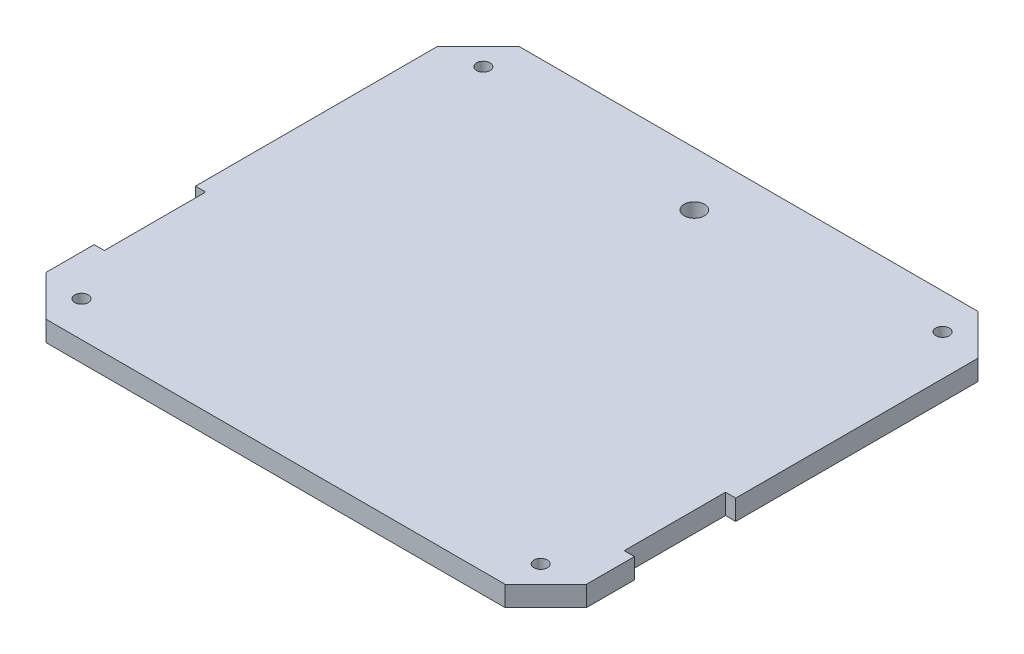
ISO-10303-21;
HEADER;
FILE_DESCRIPTION(('STEP AP214'),'2;1');
FILE_NAME('part.step','',(''),(''),'','','');
FILE_SCHEMA(('AUTOMOTIVE_DESIGN { 1 0 10303 214 1 1 1 1 }'));
ENDSEC;
DATA;
#1=APPLICATION_CONTEXT('core data for automotive mechanical design processes');
#2=APPLICATION_PROTOCOL_DEFINITION('international standard','automotive_design',2000,#1);
#3=PRODUCT_CONTEXT('',#1,'mechanical');
#4=PRODUCT('Part','Part','',(#3));
#5=PRODUCT_RELATED_PRODUCT_CATEGORY('part','',(#4));
#6=PRODUCT_DEFINITION_FORMATION('','',#4);
#7=PRODUCT_DEFINITION_CONTEXT('part definition',#1,'design');
#8=PRODUCT_DEFINITION('design','',#6,#7);
#9=PRODUCT_DEFINITION_SHAPE('','',#8);
#10=(LENGTH_UNIT() NAMED_UNIT(*) SI_UNIT(.MILLI.,.METRE.));
#11=(NAMED_UNIT(*) PLANE_ANGLE_UNIT() SI_UNIT($,.RADIAN.));
#12=(NAMED_UNIT(*) SI_UNIT($,.STERADIAN.) SOLID_ANGLE_UNIT());
#13=UNCERTAINTY_MEASURE_WITH_UNIT(LENGTH_MEASURE(1.E-05),#10,'distance_accuracy_value','');
#14=(GEOMETRIC_REPRESENTATION_CONTEXT(3) GLOBAL_UNCERTAINTY_ASSIGNED_CONTEXT((#13)) GLOBAL_UNIT_ASSIGNED_CONTEXT((#10,
#11,#12)) REPRESENTATION_CONTEXT('',''));
#15=CARTESIAN_POINT('',(0.,0.,0.));
#16=DIRECTION('',(0.,0.,1.));
#17=DIRECTION('',(1.,0.,0.));
#18=AXIS2_PLACEMENT_3D('',#15,#16,#17);
#19=CARTESIAN_POINT('',(0.,15.,34.3683747497509));
#20=DIRECTION('',(0.,0.,-1.));
#21=DIRECTION('',(-1.,0.,0.));
#22=AXIS2_PLACEMENT_3D('',#19,#20,#21);
#23=PLANE('',#22);
#24=DIRECTION('',(1.,0.,0.));
#25=VECTOR('',#24,1.);
#26=CARTESIAN_POINT('',(0.,0.,34.3683747497509));
#27=LINE('',#26,#25);
#28=CARTESIAN_POINT('',(192.446978441032,0.,34.3683747497509));
#29=VERTEX_POINT('',#28);
#30=CARTESIAN_POINT('',(200.,0.,34.3683747497509));
#31=VERTEX_POINT('',#30);
#32=EDGE_CURVE('E260',#29,#31,#27,.T.);
#33=ORIENTED_EDGE('',*,*,#32,.T.);
#34=DIRECTION('',(0.,-1.,0.));
#35=VECTOR('',#34,1.);
#36=CARTESIAN_POINT('',(200.,15.,34.3683747497509));
#37=LINE('',#36,#35);
#38=CARTESIAN_POINT('',(200.,15.,34.3683747497509));
#39=VERTEX_POINT('',#38);
#40=EDGE_CURVE('E11',#39,#31,#37,.T.);
#41=ORIENTED_EDGE('',*,*,#40,.F.);
#42=DIRECTION('',(1.,0.,0.));
#43=VECTOR('',#42,1.);
#44=CARTESIAN_POINT('',(0.,15.,34.3683747497509));
#45=LINE('',#44,#43);
#46=CARTESIAN_POINT('',(192.446978441032,15.,34.3683747497509));
#47=VERTEX_POINT('',#46);
#48=EDGE_CURVE('E185',#47,#39,#45,.T.);
#49=ORIENTED_EDGE('',*,*,#48,.F.);
#50=DIRECTION('',(0.,-1.,0.));
#51=VECTOR('',#50,1.);
#52=CARTESIAN_POINT('',(192.446978441032,15.,34.3683747497509));
#53=LINE('',#52,#51);
#54=EDGE_CURVE('E186',#47,#29,#53,.T.);
#55=ORIENTED_EDGE('',*,*,#54,.T.);
#56=EDGE_LOOP('',(#33,#41,#49,#55));
#57=FACE_BOUND('',#56,.T.);
#58=ADVANCED_FACE('F35',(#57),#23,.F.);
#59=CARTESIAN_POINT('',(200.,15.,0.));
#60=DIRECTION('',(-1.,0.,0.));
#61=DIRECTION('',(0.,0.,1.));
#62=AXIS2_PLACEMENT_3D('',#59,#60,#61);
#63=PLANE('',#62);
#64=DIRECTION('',(0.,0.,-1.));
#65=VECTOR('',#64,1.);
#66=CARTESIAN_POINT('',(200.,0.,0.));
#67=LINE('',#66,#65);
#68=CARTESIAN_POINT('',(200.,0.,-145.));
#69=VERTEX_POINT('',#68);
#70=EDGE_CURVE('E263',#31,#69,#67,.T.);
#71=ORIENTED_EDGE('',*,*,#70,.T.);
#72=DIRECTION('',(0.,1.,0.));
#73=VECTOR('',#72,1.);
#74=CARTESIAN_POINT('',(200.,0.,-145.));
#75=LINE('',#74,#73);
#76=CARTESIAN_POINT('',(200.,15.,-145.));
#77=VERTEX_POINT('',#76);
#78=EDGE_CURVE('E49',#69,#77,#75,.T.);
#79=ORIENTED_EDGE('',*,*,#78,.T.);
#80=DIRECTION('',(0.,0.,-1.));
#81=VECTOR('',#80,1.);
#82=CARTESIAN_POINT('',(200.,15.,0.));
#83=LINE('',#82,#81);
#84=EDGE_CURVE('E297',#39,#77,#83,.T.);
#85=ORIENTED_EDGE('',*,*,#84,.F.);
#86=ORIENTED_EDGE('',*,*,#40,.T.);
#87=EDGE_LOOP('',(#71,#79,#85,#86));
#88=FACE_BOUND('',#87,.T.);
#89=ADVANCED_FACE('F302',(#88),#63,.F.);
#90=CARTESIAN_POINT('',(0.,15.,-175.));
#91=DIRECTION('',(0.,0.,-1.));
#92=DIRECTION('',(-1.,0.,0.));
#93=AXIS2_PLACEMENT_3D('',#90,#91,#92);
#94=PLANE('',#93);
#95=DIRECTION('',(0.,1.,0.));
#96=VECTOR('',#95,1.);
#97=CARTESIAN_POINT('',(170.,0.,-175.));
#98=LINE('',#97,#96);
#99=CARTESIAN_POINT('',(170.,0.,-175.));
#100=VERTEX_POINT('',#99);
#101=CARTESIAN_POINT('',(170.,15.,-175.));
#102=VERTEX_POINT('',#101);
#103=EDGE_CURVE('E274',#100,#102,#98,.T.);
#104=ORIENTED_EDGE('',*,*,#103,.F.);
#105=DIRECTION('',(1.,0.,0.));
#106=VECTOR('',#105,1.);
#107=CARTESIAN_POINT('',(0.,0.,-175.));
#108=LINE('',#107,#106);
#109=CARTESIAN_POINT('',(-170.,0.,-175.));
#110=VERTEX_POINT('',#109);
#111=EDGE_CURVE('E219',#110,#100,#108,.T.);
#112=ORIENTED_EDGE('',*,*,#111,.F.);
#113=DIRECTION('',(0.,1.,0.));
#114=VECTOR('',#113,1.);
#115=CARTESIAN_POINT('',(-170.,0.,-175.));
#116=LINE('',#115,#114);
#117=CARTESIAN_POINT('',(-170.,15.,-175.));
#118=VERTEX_POINT('',#117);
#119=EDGE_CURVE('E57',#110,#118,#116,.T.);
#120=ORIENTED_EDGE('',*,*,#119,.T.);
#121=DIRECTION('',(1.,0.,0.));
#122=VECTOR('',#121,1.);
#123=CARTESIAN_POINT('',(0.,15.,-175.));
#124=LINE('',#123,#122);
#125=EDGE_CURVE('E246',#118,#102,#124,.T.);
#126=ORIENTED_EDGE('',*,*,#125,.T.);
#127=EDGE_LOOP('',(#104,#112,#120,#126));
#128=FACE_BOUND('',#127,.T.);
#129=ADVANCED_FACE('F271',(#128),#94,.T.);
#130=CARTESIAN_POINT('',(-200.,15.,0.));
#131=DIRECTION('',(-1.,0.,0.));
#132=DIRECTION('',(0.,0.,1.));
#133=AXIS2_PLACEMENT_3D('',#130,#131,#132);
#134=PLANE('',#133);
#135=DIRECTION('',(0.,1.,0.));
#136=VECTOR('',#135,1.);
#137=CARTESIAN_POINT('',(-200.,0.,-145.));
#138=LINE('',#137,#136);
#139=CARTESIAN_POINT('',(-200.,0.,-145.));
#140=VERTEX_POINT('',#139);
#141=CARTESIAN_POINT('',(-200.,15.,-145.));
#142=VERTEX_POINT('',#141);
#143=EDGE_CURVE('E218',#140,#142,#138,.T.);
#144=ORIENTED_EDGE('',*,*,#143,.F.);
#145=DIRECTION('',(0.,0.,-1.));
#146=VECTOR('',#145,1.);
#147=CARTESIAN_POINT('',(-200.,0.,0.));
#148=LINE('',#147,#146);
#149=CARTESIAN_POINT('',(-200.,0.,34.3683747497509));
#150=VERTEX_POINT('',#149);
#151=EDGE_CURVE('E216',#150,#140,#148,.T.);
#152=ORIENTED_EDGE('',*,*,#151,.F.);
#153=DIRECTION('',(0.,-1.,0.));
#154=VECTOR('',#153,1.);
#155=CARTESIAN_POINT('',(-200.,15.,34.3683747497509));
#156=LINE('',#155,#154);
#157=CARTESIAN_POINT('',(-200.,15.,34.3683747497509));
#158=VERTEX_POINT('',#157);
#159=EDGE_CURVE('E42',#158,#150,#156,.T.);
#160=ORIENTED_EDGE('',*,*,#159,.F.);
#161=DIRECTION('',(0.,0.,-1.));
#162=VECTOR('',#161,1.);
#163=CARTESIAN_POINT('',(-200.,15.,0.));
#164=LINE('',#163,#162);
#165=EDGE_CURVE('E242',#158,#142,#164,.T.);
#166=ORIENTED_EDGE('',*,*,#165,.T.);
#167=EDGE_LOOP('',(#144,#152,#160,#166));
#168=FACE_BOUND('',#167,.T.);
#169=ADVANCED_FACE('F217',(#168),#134,.T.);
#170=CARTESIAN_POINT('',(0.,15.,34.3683747497509));
#171=DIRECTION('',(0.,0.,1.));
#172=DIRECTION('',(1.,0.,0.));
#173=AXIS2_PLACEMENT_3D('',#170,#171,#172);
#174=PLANE('',#173);
#175=DIRECTION('',(-1.,0.,0.));
#176=VECTOR('',#175,1.);
#177=CARTESIAN_POINT('',(0.,0.,34.3683747497509));
#178=LINE('',#177,#176);
#179=CARTESIAN_POINT('',(-192.446978441032,0.,34.3683747497509));
#180=VERTEX_POINT('',#179);
#181=EDGE_CURVE('E207',#180,#150,#178,.T.);
#182=ORIENTED_EDGE('',*,*,#181,.F.);
#183=DIRECTION('',(0.,-1.,0.));
#184=VECTOR('',#183,1.);
#185=CARTESIAN_POINT('',(-192.446978441032,15.,34.3683747497509));
#186=LINE('',#185,#184);
#187=CARTESIAN_POINT('',(-192.446978441032,15.,34.3683747497509));
#188=VERTEX_POINT('',#187);
#189=EDGE_CURVE('E200',#188,#180,#186,.T.);
#190=ORIENTED_EDGE('',*,*,#189,.F.);
#191=DIRECTION('',(-1.,0.,0.));
#192=VECTOR('',#191,1.);
#193=CARTESIAN_POINT('',(0.,15.,34.3683747497509));
#194=LINE('',#193,#192);
#195=EDGE_CURVE('E210',#188,#158,#194,.T.);
#196=ORIENTED_EDGE('',*,*,#195,.T.);
#197=ORIENTED_EDGE('',*,*,#159,.T.);
#198=EDGE_LOOP('',(#182,#190,#196,#197));
#199=FACE_BOUND('',#198,.T.);
#200=ADVANCED_FACE('F205',(#199),#174,.T.);
#201=CARTESIAN_POINT('',(-192.446978441032,15.,0.));
#202=DIRECTION('',(-1.,0.,0.));
#203=DIRECTION('',(0.,0.,1.));
#204=AXIS2_PLACEMENT_3D('',#201,#202,#203);
#205=PLANE('',#204);
#206=DIRECTION('',(0.,0.,-1.));
#207=VECTOR('',#206,1.);
#208=CARTESIAN_POINT('',(-192.446978441032,0.,0.));
#209=LINE('',#208,#207);
#210=CARTESIAN_POINT('',(-192.446978441032,0.,109.368374749751));
#211=VERTEX_POINT('',#210);
#212=EDGE_CURVE('E223',#211,#180,#209,.T.);
#213=ORIENTED_EDGE('',*,*,#212,.F.);
#214=DIRECTION('',(0.,-1.,0.));
#215=VECTOR('',#214,1.);
#216=CARTESIAN_POINT('',(-192.446978441032,15.,109.368374749751));
#217=LINE('',#216,#215);
#218=CARTESIAN_POINT('',(-192.446978441032,15.,109.368374749751));
#219=VERTEX_POINT('',#218);
#220=EDGE_CURVE('E198',#219,#211,#217,.T.);
#221=ORIENTED_EDGE('',*,*,#220,.F.);
#222=DIRECTION('',(0.,0.,-1.));
#223=VECTOR('',#222,1.);
#224=CARTESIAN_POINT('',(-192.446978441032,15.,0.));
#225=LINE('',#224,#223);
#226=EDGE_CURVE('E236',#219,#188,#225,.T.);
#227=ORIENTED_EDGE('',*,*,#226,.T.);
#228=ORIENTED_EDGE('',*,*,#189,.T.);
#229=EDGE_LOOP('',(#213,#221,#227,#228));
#230=FACE_BOUND('',#229,.T.);
#231=ADVANCED_FACE('F233',(#230),#205,.T.);
#232=CARTESIAN_POINT('',(0.,15.,109.368374749751));
#233=DIRECTION('',(0.,0.,1.));
#234=DIRECTION('',(1.,0.,0.));
#235=AXIS2_PLACEMENT_3D('',#232,#233,#234);
#236=PLANE('',#235);
#237=DIRECTION('',(-1.,0.,0.));
#238=VECTOR('',#237,1.);
#239=CARTESIAN_POINT('',(0.,0.,109.368374749751));
#240=LINE('',#239,#238);
#241=CARTESIAN_POINT('',(-200.,0.,109.368374749751));
#242=VERTEX_POINT('',#241);
#243=EDGE_CURVE('E177',#211,#242,#240,.T.);
#244=ORIENTED_EDGE('',*,*,#243,.T.);
#245=DIRECTION('',(0.,-1.,0.));
#246=VECTOR('',#245,1.);
#247=CARTESIAN_POINT('',(-200.,15.,109.368374749751));
#248=LINE('',#247,#246);
#249=CARTESIAN_POINT('',(-200.,15.,109.368374749751));
#250=VERTEX_POINT('',#249);
#251=EDGE_CURVE('E195',#250,#242,#248,.T.);
#252=ORIENTED_EDGE('',*,*,#251,.F.);
#253=DIRECTION('',(-1.,0.,0.));
#254=VECTOR('',#253,1.);
#255=CARTESIAN_POINT('',(0.,15.,109.368374749751));
#256=LINE('',#255,#254);
#257=EDGE_CURVE('E244',#219,#250,#256,.T.);
#258=ORIENTED_EDGE('',*,*,#257,.F.);
#259=ORIENTED_EDGE('',*,*,#220,.T.);
#260=EDGE_LOOP('',(#244,#252,#258,#259));
#261=FACE_BOUND('',#260,.T.);
#262=ADVANCED_FACE('F230',(#261),#236,.F.);
#263=CARTESIAN_POINT('',(-200.,15.,0.));
#264=DIRECTION('',(-1.,0.,0.));
#265=DIRECTION('',(0.,0.,1.));
#266=AXIS2_PLACEMENT_3D('',#263,#264,#265);
#267=PLANE('',#266);
#268=DIRECTION('',(0.,1.,0.));
#269=VECTOR('',#268,1.);
#270=CARTESIAN_POINT('',(-200.,0.,145.));
#271=LINE('',#270,#269);
#272=CARTESIAN_POINT('',(-200.,0.,145.));
#273=VERTEX_POINT('',#272);
#274=CARTESIAN_POINT('',(-200.,15.,145.));
#275=VERTEX_POINT('',#274);
#276=EDGE_CURVE('E152',#273,#275,#271,.T.);
#277=ORIENTED_EDGE('',*,*,#276,.T.);
#278=DIRECTION('',(0.,0.,-1.));
#279=VECTOR('',#278,1.);
#280=CARTESIAN_POINT('',(-200.,15.,0.));
#281=LINE('',#280,#279);
#282=EDGE_CURVE('E251',#275,#250,#281,.T.);
#283=ORIENTED_EDGE('',*,*,#282,.T.);
#284=ORIENTED_EDGE('',*,*,#251,.T.);
#285=DIRECTION('',(0.,0.,-1.));
#286=VECTOR('',#285,1.);
#287=CARTESIAN_POINT('',(-200.,0.,0.));
#288=LINE('',#287,#286);
#289=EDGE_CURVE('E173',#273,#242,#288,.T.);
#290=ORIENTED_EDGE('',*,*,#289,.F.);
#291=EDGE_LOOP('',(#277,#283,#284,#290));
#292=FACE_BOUND('',#291,.T.);
#293=ADVANCED_FACE('F356',(#292),#267,.T.);
#294=CARTESIAN_POINT('',(0.,15.,175.));
#295=DIRECTION('',(0.,0.,-1.));
#296=DIRECTION('',(-1.,0.,0.));
#297=AXIS2_PLACEMENT_3D('',#294,#295,#296);
#298=PLANE('',#297);
#299=DIRECTION('',(1.,0.,0.));
#300=VECTOR('',#299,1.);
#301=CARTESIAN_POINT('',(0.,15.,175.));
#302=LINE('',#301,#300);
#303=CARTESIAN_POINT('',(-170.,15.,175.));
#304=VERTEX_POINT('',#303);
#305=CARTESIAN_POINT('',(170.,15.,175.));
#306=VERTEX_POINT('',#305);
#307=EDGE_CURVE('E165',#304,#306,#302,.T.);
#308=ORIENTED_EDGE('',*,*,#307,.F.);
#309=DIRECTION('',(0.,1.,0.));
#310=VECTOR('',#309,1.);
#311=CARTESIAN_POINT('',(-170.,0.,175.));
#312=LINE('',#311,#310);
#313=CARTESIAN_POINT('',(-170.,0.,175.));
#314=VERTEX_POINT('',#313);
#315=EDGE_CURVE('E149',#314,#304,#312,.T.);
#316=ORIENTED_EDGE('',*,*,#315,.F.);
#317=DIRECTION('',(1.,0.,0.));
#318=VECTOR('',#317,1.);
#319=CARTESIAN_POINT('',(0.,0.,175.));
#320=LINE('',#319,#318);
#321=CARTESIAN_POINT('',(170.,0.,175.));
#322=VERTEX_POINT('',#321);
#323=EDGE_CURVE('E163',#314,#322,#320,.T.);
#324=ORIENTED_EDGE('',*,*,#323,.T.);
#325=DIRECTION('',(0.,1.,0.));
#326=VECTOR('',#325,1.);
#327=CARTESIAN_POINT('',(170.,0.,175.));
#328=LINE('',#327,#326);
#329=EDGE_CURVE('E322',#322,#306,#328,.T.);
#330=ORIENTED_EDGE('',*,*,#329,.T.);
#331=EDGE_LOOP('',(#308,#316,#324,#330));
#332=FACE_BOUND('',#331,.T.);
#333=ADVANCED_FACE('F161',(#332),#298,.F.);
#334=CARTESIAN_POINT('',(200.,15.,0.));
#335=DIRECTION('',(-1.,0.,0.));
#336=DIRECTION('',(0.,0.,1.));
#337=AXIS2_PLACEMENT_3D('',#334,#335,#336);
#338=PLANE('',#337);
#339=DIRECTION('',(0.,0.,-1.));
#340=VECTOR('',#339,1.);
#341=CARTESIAN_POINT('',(200.,15.,0.));
#342=LINE('',#341,#340);
#343=CARTESIAN_POINT('',(200.,15.,145.));
#344=VERTEX_POINT('',#343);
#345=CARTESIAN_POINT('',(200.,15.,109.368374749751));
#346=VERTEX_POINT('',#345);
#347=EDGE_CURVE('E254',#344,#346,#342,.T.);
#348=ORIENTED_EDGE('',*,*,#347,.F.);
#349=DIRECTION('',(0.,1.,0.));
#350=VECTOR('',#349,1.);
#351=CARTESIAN_POINT('',(200.,0.,145.));
#352=LINE('',#351,#350);
#353=CARTESIAN_POINT('',(200.,0.,145.));
#354=VERTEX_POINT('',#353);
#355=EDGE_CURVE('E319',#354,#344,#352,.T.);
#356=ORIENTED_EDGE('',*,*,#355,.F.);
#357=DIRECTION('',(0.,0.,-1.));
#358=VECTOR('',#357,1.);
#359=CARTESIAN_POINT('',(200.,0.,0.));
#360=LINE('',#359,#358);
#361=CARTESIAN_POINT('',(200.,0.,109.368374749751));
#362=VERTEX_POINT('',#361);
#363=EDGE_CURVE('E172',#354,#362,#360,.T.);
#364=ORIENTED_EDGE('',*,*,#363,.T.);
#365=DIRECTION('',(0.,-1.,0.));
#366=VECTOR('',#365,1.);
#367=CARTESIAN_POINT('',(200.,15.,109.368374749751));
#368=LINE('',#367,#366);
#369=EDGE_CURVE('E192',#346,#362,#368,.T.);
#370=ORIENTED_EDGE('',*,*,#369,.F.);
#371=EDGE_LOOP('',(#348,#356,#364,#370));
#372=FACE_BOUND('',#371,.T.);
#373=ADVANCED_FACE('F318',(#372),#338,.F.);
#374=CARTESIAN_POINT('',(0.,15.,109.368374749751));
#375=DIRECTION('',(0.,0.,-1.));
#376=DIRECTION('',(-1.,0.,0.));
#377=AXIS2_PLACEMENT_3D('',#374,#375,#376);
#378=PLANE('',#377);
#379=DIRECTION('',(1.,0.,0.));
#380=VECTOR('',#379,1.);
#381=CARTESIAN_POINT('',(0.,0.,109.368374749751));
#382=LINE('',#381,#380);
#383=CARTESIAN_POINT('',(192.446978441032,0.,109.368374749751));
#384=VERTEX_POINT('',#383);
#385=EDGE_CURVE('E175',#384,#362,#382,.T.);
#386=ORIENTED_EDGE('',*,*,#385,.F.);
#387=DIRECTION('',(0.,-1.,0.));
#388=VECTOR('',#387,1.);
#389=CARTESIAN_POINT('',(192.446978441032,15.,109.368374749751));
#390=LINE('',#389,#388);
#391=CARTESIAN_POINT('',(192.446978441032,15.,109.368374749751));
#392=VERTEX_POINT('',#391);
#393=EDGE_CURVE('E189',#392,#384,#390,.T.);
#394=ORIENTED_EDGE('',*,*,#393,.F.);
#395=DIRECTION('',(1.,0.,0.));
#396=VECTOR('',#395,1.);
#397=CARTESIAN_POINT('',(0.,15.,109.368374749751));
#398=LINE('',#397,#396);
#399=EDGE_CURVE('E256',#392,#346,#398,.T.);
#400=ORIENTED_EDGE('',*,*,#399,.T.);
#401=ORIENTED_EDGE('',*,*,#369,.T.);
#402=EDGE_LOOP('',(#386,#394,#400,#401));
#403=FACE_BOUND('',#402,.T.);
#404=ADVANCED_FACE('F313',(#403),#378,.T.);
#405=CARTESIAN_POINT('',(192.446978441032,15.,0.));
#406=DIRECTION('',(-1.,0.,0.));
#407=DIRECTION('',(0.,0.,1.));
#408=AXIS2_PLACEMENT_3D('',#405,#406,#407);
#409=PLANE('',#408);
#410=DIRECTION('',(0.,0.,-1.));
#411=VECTOR('',#410,1.);
#412=CARTESIAN_POINT('',(192.446978441032,0.,0.));
#413=LINE('',#412,#411);
#414=EDGE_CURVE('E183',#384,#29,#413,.T.);
#415=ORIENTED_EDGE('',*,*,#414,.T.);
#416=ORIENTED_EDGE('',*,*,#54,.F.);
#417=DIRECTION('',(0.,0.,-1.));
#418=VECTOR('',#417,1.);
#419=CARTESIAN_POINT('',(192.446978441032,15.,0.));
#420=LINE('',#419,#418);
#421=EDGE_CURVE('E190',#392,#47,#420,.T.);
#422=ORIENTED_EDGE('',*,*,#421,.F.);
#423=ORIENTED_EDGE('',*,*,#393,.T.);
#424=EDGE_LOOP('',(#415,#416,#422,#423));
#425=FACE_BOUND('',#424,.T.);
#426=ADVANCED_FACE('F310',(#425),#409,.F.);
#427=CARTESIAN_POINT('',(0.,15.,0.));
#428=DIRECTION('',(0.,1.,0.));
#429=DIRECTION('',(0.,0.,1.));
#430=AXIS2_PLACEMENT_3D('',#427,#428,#429);
#431=PLANE('',#430);
#432=CARTESIAN_POINT('',(0.,15.,-135.));
#433=DIRECTION('',(0.,-1.,0.));
#434=DIRECTION('',(0.,0.,-1.));
#435=AXIS2_PLACEMENT_3D('',#432,#433,#434);
#436=CIRCLE('',#435,7.5);
#437=CARTESIAN_POINT('',(0.,15.,-142.5));
#438=VERTEX_POINT('',#437);
#439=EDGE_CURVE('E429',#438,#438,#436,.T.);
#440=ORIENTED_EDGE('',*,*,#439,.T.);
#441=EDGE_LOOP('',(#440));
#442=FACE_BOUND('',#441,.T.);
#443=DIRECTION('',(-0.707106781186547,0.,-0.707106781186547));
#444=VECTOR('',#443,1.);
#445=CARTESIAN_POINT('',(-170.,15.,175.));
#446=LINE('',#445,#444);
#447=EDGE_CURVE('E156',#304,#275,#446,.T.);
#448=ORIENTED_EDGE('',*,*,#447,.F.);
#449=ORIENTED_EDGE('',*,*,#307,.T.);
#450=DIRECTION('',(-0.707106781186547,0.,0.707106781186547));
#451=VECTOR('',#450,1.);
#452=CARTESIAN_POINT('',(170.,15.,175.));
#453=LINE('',#452,#451);
#454=EDGE_CURVE('E276',#344,#306,#453,.T.);
#455=ORIENTED_EDGE('',*,*,#454,.F.);
#456=ORIENTED_EDGE('',*,*,#347,.T.);
#457=ORIENTED_EDGE('',*,*,#399,.F.);
#458=ORIENTED_EDGE('',*,*,#421,.T.);
#459=ORIENTED_EDGE('',*,*,#48,.T.);
#460=ORIENTED_EDGE('',*,*,#84,.T.);
#461=DIRECTION('',(0.707106781186547,0.,0.707106781186547));
#462=VECTOR('',#461,1.);
#463=CARTESIAN_POINT('',(170.,15.,-175.));
#464=LINE('',#463,#462);
#465=EDGE_CURVE('E281',#102,#77,#464,.T.);
#466=ORIENTED_EDGE('',*,*,#465,.F.);
#467=ORIENTED_EDGE('',*,*,#125,.F.);
#468=DIRECTION('',(0.707106781186547,0.,-0.707106781186547));
#469=VECTOR('',#468,1.);
#470=CARTESIAN_POINT('',(-170.,15.,-175.));
#471=LINE('',#470,#469);
#472=EDGE_CURVE('E166',#142,#118,#471,.T.);
#473=ORIENTED_EDGE('',*,*,#472,.F.);
#474=ORIENTED_EDGE('',*,*,#165,.F.);
#475=ORIENTED_EDGE('',*,*,#195,.F.);
#476=ORIENTED_EDGE('',*,*,#226,.F.);
#477=ORIENTED_EDGE('',*,*,#257,.T.);
#478=ORIENTED_EDGE('',*,*,#282,.F.);
#479=EDGE_LOOP('',(#448,#449,#455,#456,#457,#458,#459,#460,#466,#467,#473,#474,#475,#476,#477,#478));
#480=FACE_BOUND('',#479,.T.);
#481=CARTESIAN_POINT('',(-170.,15.,-148.75));
#482=DIRECTION('',(0.,1.,0.));
#483=DIRECTION('',(0.,0.,1.));
#484=AXIS2_PLACEMENT_3D('',#481,#482,#483);
#485=CIRCLE('',#484,5.00000000000002);
#486=CARTESIAN_POINT('',(-170.,15.,-143.75));
#487=VERTEX_POINT('',#486);
#488=EDGE_CURVE('E287',#487,#487,#485,.T.);
#489=ORIENTED_EDGE('',*,*,#488,.F.);
#490=EDGE_LOOP('',(#489));
#491=FACE_BOUND('',#490,.T.);
#492=CARTESIAN_POINT('',(170.,15.,-148.75));
#493=DIRECTION('',(0.,1.,0.));
#494=DIRECTION('',(0.,0.,-1.));
#495=AXIS2_PLACEMENT_3D('',#492,#493,#494);
#496=CIRCLE('',#495,5.00000000000002);
#497=CARTESIAN_POINT('',(170.,15.,-153.75));
#498=VERTEX_POINT('',#497);
#499=EDGE_CURVE('E412',#498,#498,#496,.T.);
#500=ORIENTED_EDGE('',*,*,#499,.F.);
#501=EDGE_LOOP('',(#500));
#502=FACE_BOUND('',#501,.T.);
#503=CARTESIAN_POINT('',(170.,15.,148.75));
#504=DIRECTION('',(0.,1.,0.));
#505=DIRECTION('',(0.,0.,1.));
#506=AXIS2_PLACEMENT_3D('',#503,#504,#505);
#507=CIRCLE('',#506,5.00000000000002);
#508=CARTESIAN_POINT('',(170.,15.,153.75));
#509=VERTEX_POINT('',#508);
#510=EDGE_CURVE('E418',#509,#509,#507,.T.);
#511=ORIENTED_EDGE('',*,*,#510,.F.);
#512=EDGE_LOOP('',(#511));
#513=FACE_BOUND('',#512,.T.);
#514=CARTESIAN_POINT('',(-170.,15.,148.75));
#515=DIRECTION('',(0.,1.,0.));
#516=DIRECTION('',(0.,0.,-1.));
#517=AXIS2_PLACEMENT_3D('',#514,#515,#516);
#518=CIRCLE('',#517,5.00000000000002);
#519=CARTESIAN_POINT('',(-170.,15.,143.75));
#520=VERTEX_POINT('',#519);
#521=EDGE_CURVE('E427',#520,#520,#518,.T.);
#522=ORIENTED_EDGE('',*,*,#521,.F.);
#523=EDGE_LOOP('',(#522));
#524=FACE_BOUND('',#523,.T.);
#525=ADVANCED_FACE('F238',(#442,#480,#491,#502,#513,#524),#431,.T.);
#526=CARTESIAN_POINT('',(0.,0.,0.));
#527=DIRECTION('',(0.,1.,0.));
#528=DIRECTION('',(0.,0.,1.));
#529=AXIS2_PLACEMENT_3D('',#526,#527,#528);
#530=PLANE('',#529);
#531=CARTESIAN_POINT('',(0.,0.,-135.));
#532=DIRECTION('',(0.,-1.,0.));
#533=DIRECTION('',(0.,0.,-1.));
#534=AXIS2_PLACEMENT_3D('',#531,#532,#533);
#535=CIRCLE('',#534,7.5);
#536=CARTESIAN_POINT('',(0.,0.,-142.5));
#537=VERTEX_POINT('',#536);
#538=EDGE_CURVE('E435',#537,#537,#535,.T.);
#539=ORIENTED_EDGE('',*,*,#538,.F.);
#540=EDGE_LOOP('',(#539));
#541=FACE_BOUND('',#540,.T.);
#542=CARTESIAN_POINT('',(-170.,0.,-148.75));
#543=DIRECTION('',(0.,1.,0.));
#544=DIRECTION('',(0.,0.,1.));
#545=AXIS2_PLACEMENT_3D('',#542,#543,#544);
#546=CIRCLE('',#545,5.00000000000002);
#547=CARTESIAN_POINT('',(-170.,0.,-143.75));
#548=VERTEX_POINT('',#547);
#549=EDGE_CURVE('E284',#548,#548,#546,.T.);
#550=ORIENTED_EDGE('',*,*,#549,.T.);
#551=EDGE_LOOP('',(#550));
#552=FACE_BOUND('',#551,.T.);
#553=CARTESIAN_POINT('',(170.,0.,-148.75));
#554=DIRECTION('',(0.,1.,0.));
#555=DIRECTION('',(0.,0.,-1.));
#556=AXIS2_PLACEMENT_3D('',#553,#554,#555);
#557=CIRCLE('',#556,5.00000000000002);
#558=CARTESIAN_POINT('',(170.,0.,-153.75));
#559=VERTEX_POINT('',#558);
#560=EDGE_CURVE('E290',#559,#559,#557,.T.);
#561=ORIENTED_EDGE('',*,*,#560,.T.);
#562=EDGE_LOOP('',(#561));
#563=FACE_BOUND('',#562,.T.);
#564=CARTESIAN_POINT('',(170.,0.,148.75));
#565=DIRECTION('',(0.,1.,0.));
#566=DIRECTION('',(0.,0.,1.));
#567=AXIS2_PLACEMENT_3D('',#564,#565,#566);
#568=CIRCLE('',#567,5.00000000000002);
#569=CARTESIAN_POINT('',(170.,0.,153.75));
#570=VERTEX_POINT('',#569);
#571=EDGE_CURVE('E414',#570,#570,#568,.T.);
#572=ORIENTED_EDGE('',*,*,#571,.T.);
#573=EDGE_LOOP('',(#572));
#574=FACE_BOUND('',#573,.T.);
#575=CARTESIAN_POINT('',(-170.,0.,148.75));
#576=DIRECTION('',(0.,1.,0.));
#577=DIRECTION('',(0.,0.,-1.));
#578=AXIS2_PLACEMENT_3D('',#575,#576,#577);
#579=CIRCLE('',#578,5.00000000000002);
#580=CARTESIAN_POINT('',(-170.,0.,143.75));
#581=VERTEX_POINT('',#580);
#582=EDGE_CURVE('E424',#581,#581,#579,.T.);
#583=ORIENTED_EDGE('',*,*,#582,.T.);
#584=EDGE_LOOP('',(#583));
#585=FACE_BOUND('',#584,.T.);
#586=ORIENTED_EDGE('',*,*,#323,.F.);
#587=DIRECTION('',(-0.707106781186547,0.,-0.707106781186547));
#588=VECTOR('',#587,1.);
#589=CARTESIAN_POINT('',(-170.,0.,175.));
#590=LINE('',#589,#588);
#591=EDGE_CURVE('E146',#314,#273,#590,.T.);
#592=ORIENTED_EDGE('',*,*,#591,.T.);
#593=ORIENTED_EDGE('',*,*,#289,.T.);
#594=ORIENTED_EDGE('',*,*,#243,.F.);
#595=ORIENTED_EDGE('',*,*,#212,.T.);
#596=ORIENTED_EDGE('',*,*,#181,.T.);
#597=ORIENTED_EDGE('',*,*,#151,.T.);
#598=DIRECTION('',(0.707106781186547,0.,-0.707106781186547));
#599=VECTOR('',#598,1.);
#600=CARTESIAN_POINT('',(-170.,0.,-175.));
#601=LINE('',#600,#599);
#602=EDGE_CURVE('E268',#140,#110,#601,.T.);
#603=ORIENTED_EDGE('',*,*,#602,.T.);
#604=ORIENTED_EDGE('',*,*,#111,.T.);
#605=DIRECTION('',(0.707106781186547,0.,0.707106781186547));
#606=VECTOR('',#605,1.);
#607=CARTESIAN_POINT('',(170.,0.,-175.));
#608=LINE('',#607,#606);
#609=EDGE_CURVE('E267',#100,#69,#608,.T.);
#610=ORIENTED_EDGE('',*,*,#609,.T.);
#611=ORIENTED_EDGE('',*,*,#70,.F.);
#612=ORIENTED_EDGE('',*,*,#32,.F.);
#613=ORIENTED_EDGE('',*,*,#414,.F.);
#614=ORIENTED_EDGE('',*,*,#385,.T.);
#615=ORIENTED_EDGE('',*,*,#363,.F.);
#616=DIRECTION('',(-0.707106781186547,0.,0.707106781186547));
#617=VECTOR('',#616,1.);
#618=CARTESIAN_POINT('',(170.,0.,175.));
#619=LINE('',#618,#617);
#620=EDGE_CURVE('E171',#354,#322,#619,.T.);
#621=ORIENTED_EDGE('',*,*,#620,.T.);
#622=EDGE_LOOP('',(#586,#592,#593,#594,#595,#596,#597,#603,#604,#610,#611,#612,#613,#614,#615,#621));
#623=FACE_BOUND('',#622,.T.);
#624=ADVANCED_FACE('F169',(#541,#552,#563,#574,#585,#623),#530,.F.);
#625=CARTESIAN_POINT('',(-170.,0.,-175.));
#626=DIRECTION('',(0.707106781186547,0.,0.707106781186547));
#627=DIRECTION('',(0.707106781186548,0.,-0.707106781186548));
#628=AXIS2_PLACEMENT_3D('',#625,#626,#627);
#629=PLANE('',#628);
#630=ORIENTED_EDGE('',*,*,#472,.T.);
#631=ORIENTED_EDGE('',*,*,#119,.F.);
#632=ORIENTED_EDGE('',*,*,#602,.F.);
#633=ORIENTED_EDGE('',*,*,#143,.T.);
#634=EDGE_LOOP('',(#630,#631,#632,#633));
#635=FACE_BOUND('',#634,.T.);
#636=ADVANCED_FACE('F370',(#635),#629,.F.);
#637=CARTESIAN_POINT('',(-170.,0.,148.75));
#638=DIRECTION('',(0.,1.,0.));
#639=DIRECTION('',(0.,0.,1.));
#640=AXIS2_PLACEMENT_3D('',#637,#638,#639);
#641=CYLINDRICAL_SURFACE('',#640,5.00000000000002);
#642=ORIENTED_EDGE('',*,*,#582,.F.);
#643=EDGE_LOOP('',(#642));
#644=FACE_BOUND('',#643,.T.);
#645=ORIENTED_EDGE('',*,*,#521,.T.);
#646=EDGE_LOOP('',(#645));
#647=FACE_BOUND('',#646,.T.);
#648=ADVANCED_FACE('F376',(#644,#647),#641,.F.);
#649=CARTESIAN_POINT('',(170.,0.,148.75));
#650=DIRECTION('',(0.,1.,0.));
#651=DIRECTION('',(0.,0.,1.));
#652=AXIS2_PLACEMENT_3D('',#649,#650,#651);
#653=CYLINDRICAL_SURFACE('',#652,5.00000000000002);
#654=ORIENTED_EDGE('',*,*,#571,.F.);
#655=EDGE_LOOP('',(#654));
#656=FACE_BOUND('',#655,.T.);
#657=ORIENTED_EDGE('',*,*,#510,.T.);
#658=EDGE_LOOP('',(#657));
#659=FACE_BOUND('',#658,.T.);
#660=ADVANCED_FACE('F380',(#656,#659),#653,.F.);
#661=CARTESIAN_POINT('',(170.,0.,-148.75));
#662=DIRECTION('',(0.,1.,0.));
#663=DIRECTION('',(0.,0.,1.));
#664=AXIS2_PLACEMENT_3D('',#661,#662,#663);
#665=CYLINDRICAL_SURFACE('',#664,5.00000000000002);
#666=ORIENTED_EDGE('',*,*,#560,.F.);
#667=EDGE_LOOP('',(#666));
#668=FACE_BOUND('',#667,.T.);
#669=ORIENTED_EDGE('',*,*,#499,.T.);
#670=EDGE_LOOP('',(#669));
#671=FACE_BOUND('',#670,.T.);
#672=ADVANCED_FACE('F336',(#668,#671),#665,.F.);
#673=CARTESIAN_POINT('',(-170.,0.,-148.75));
#674=DIRECTION('',(0.,1.,0.));
#675=DIRECTION('',(0.,0.,1.));
#676=AXIS2_PLACEMENT_3D('',#673,#674,#675);
#677=CYLINDRICAL_SURFACE('',#676,5.00000000000002);
#678=ORIENTED_EDGE('',*,*,#549,.F.);
#679=EDGE_LOOP('',(#678));
#680=FACE_BOUND('',#679,.T.);
#681=ORIENTED_EDGE('',*,*,#488,.T.);
#682=EDGE_LOOP('',(#681));
#683=FACE_BOUND('',#682,.T.);
#684=ADVANCED_FACE('F329',(#680,#683),#677,.F.);
#685=CARTESIAN_POINT('',(170.,0.,-175.));
#686=DIRECTION('',(-0.707106781186547,0.,0.707106781186547));
#687=DIRECTION('',(0.707106781186548,0.,0.707106781186548));
#688=AXIS2_PLACEMENT_3D('',#685,#686,#687);
#689=PLANE('',#688);
#690=ORIENTED_EDGE('',*,*,#465,.T.);
#691=ORIENTED_EDGE('',*,*,#78,.F.);
#692=ORIENTED_EDGE('',*,*,#609,.F.);
#693=ORIENTED_EDGE('',*,*,#103,.T.);
#694=EDGE_LOOP('',(#690,#691,#692,#693));
#695=FACE_BOUND('',#694,.T.);
#696=ADVANCED_FACE('F326',(#695),#689,.F.);
#697=CARTESIAN_POINT('',(170.,0.,175.));
#698=DIRECTION('',(-0.707106781186547,0.,-0.707106781186547));
#699=DIRECTION('',(-0.707106781186548,0.,0.707106781186548));
#700=AXIS2_PLACEMENT_3D('',#697,#698,#699);
#701=PLANE('',#700);
#702=ORIENTED_EDGE('',*,*,#454,.T.);
#703=ORIENTED_EDGE('',*,*,#329,.F.);
#704=ORIENTED_EDGE('',*,*,#620,.F.);
#705=ORIENTED_EDGE('',*,*,#355,.T.);
#706=EDGE_LOOP('',(#702,#703,#704,#705));
#707=FACE_BOUND('',#706,.T.);
#708=ADVANCED_FACE('F328',(#707),#701,.F.);
#709=CARTESIAN_POINT('',(-170.,0.,175.));
#710=DIRECTION('',(0.707106781186547,0.,-0.707106781186547));
#711=DIRECTION('',(-0.707106781186548,0.,-0.707106781186548));
#712=AXIS2_PLACEMENT_3D('',#709,#710,#711);
#713=PLANE('',#712);
#714=ORIENTED_EDGE('',*,*,#447,.T.);
#715=ORIENTED_EDGE('',*,*,#276,.F.);
#716=ORIENTED_EDGE('',*,*,#591,.F.);
#717=ORIENTED_EDGE('',*,*,#315,.T.);
#718=EDGE_LOOP('',(#714,#715,#716,#717));
#719=FACE_BOUND('',#718,.T.);
#720=ADVANCED_FACE('F148',(#719),#713,.F.);
#721=CARTESIAN_POINT('',(0.,15.,-135.));
#722=DIRECTION('',(0.,-1.,0.));
#723=DIRECTION('',(0.,0.,-1.));
#724=AXIS2_PLACEMENT_3D('',#721,#722,#723);
#725=CYLINDRICAL_SURFACE('',#724,7.5);
#726=ORIENTED_EDGE('',*,*,#439,.F.);
#727=EDGE_LOOP('',(#726));
#728=FACE_BOUND('',#727,.T.);
#729=ORIENTED_EDGE('',*,*,#538,.T.);
#730=EDGE_LOOP('',(#729));
#731=FACE_BOUND('',#730,.T.);
#732=ADVANCED_FACE('F393',(#728,#731),#725,.F.);
#733=CLOSED_SHELL('',(#58,#89,#129,#169,#200,#231,#262,#293,#333,#373,#404,#426,#525,#624,#636,
#648,#660,#672,#684,#696,#708,#720,#732));
#734=MANIFOLD_SOLID_BREP('B2',#733);
#735=ADVANCED_BREP_SHAPE_REPRESENTATION('',(#18,#734),#14);
#736=SHAPE_DEFINITION_REPRESENTATION(#9,#735);
ENDSEC;
END-ISO-10303-21;
